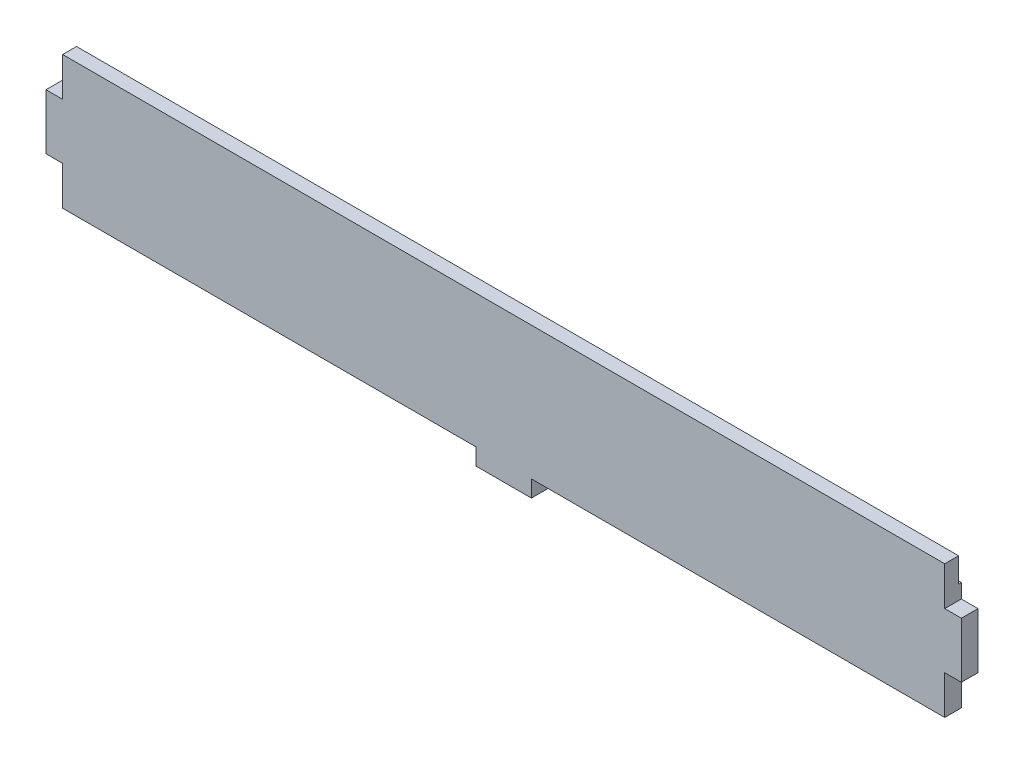
ISO-10303-21;
HEADER;
FILE_DESCRIPTION(('STEP AP214'),'2;1');
FILE_NAME('part.step','',(''),(''),'','','');
FILE_SCHEMA(('AUTOMOTIVE_DESIGN { 1 0 10303 214 1 1 1 1 }'));
ENDSEC;
DATA;
#1=APPLICATION_CONTEXT('core data for automotive mechanical design processes');
#2=APPLICATION_PROTOCOL_DEFINITION('international standard','automotive_design',2000,#1);
#3=PRODUCT_CONTEXT('',#1,'mechanical');
#4=PRODUCT('Part','Part','',(#3));
#5=PRODUCT_RELATED_PRODUCT_CATEGORY('part','',(#4));
#6=PRODUCT_DEFINITION_FORMATION('','',#4);
#7=PRODUCT_DEFINITION_CONTEXT('part definition',#1,'design');
#8=PRODUCT_DEFINITION('design','',#6,#7);
#9=PRODUCT_DEFINITION_SHAPE('','',#8);
#10=(LENGTH_UNIT() NAMED_UNIT(*) SI_UNIT(.MILLI.,.METRE.));
#11=(NAMED_UNIT(*) PLANE_ANGLE_UNIT() SI_UNIT($,.RADIAN.));
#12=(NAMED_UNIT(*) SI_UNIT($,.STERADIAN.) SOLID_ANGLE_UNIT());
#13=UNCERTAINTY_MEASURE_WITH_UNIT(LENGTH_MEASURE(1.E-05),#10,'distance_accuracy_value','');
#14=(GEOMETRIC_REPRESENTATION_CONTEXT(3) GLOBAL_UNCERTAINTY_ASSIGNED_CONTEXT((#13)) GLOBAL_UNIT_ASSIGNED_CONTEXT((#10,
#11,#12)) REPRESENTATION_CONTEXT('',''));
#15=CARTESIAN_POINT('',(0.,0.,0.));
#16=DIRECTION('',(0.,0.,1.));
#17=DIRECTION('',(1.,0.,0.));
#18=AXIS2_PLACEMENT_3D('',#15,#16,#17);
#19=CARTESIAN_POINT('',(0.,54.0000000000001,6.));
#20=DIRECTION('',(0.,-1.,0.));
#21=DIRECTION('',(1.,0.,0.));
#22=AXIS2_PLACEMENT_3D('',#19,#20,#21);
#23=PLANE('',#22);
#24=DIRECTION('',(1.,0.,0.));
#25=VECTOR('',#24,1.);
#26=CARTESIAN_POINT('',(-6.,54.0000000000001,1.));
#27=LINE('',#26,#25);
#28=CARTESIAN_POINT('',(-324.,54.0000000000001,1.));
#29=VERTEX_POINT('',#28);
#30=CARTESIAN_POINT('',(-6.,54.0000000000001,1.));
#31=VERTEX_POINT('',#30);
#32=EDGE_CURVE('E50',#29,#31,#27,.T.);
#33=ORIENTED_EDGE('',*,*,#32,.F.);
#34=DIRECTION('',(0.,0.,1.));
#35=VECTOR('',#34,1.);
#36=CARTESIAN_POINT('',(-324.,54.0000000000001,0.));
#37=LINE('',#36,#35);
#38=CARTESIAN_POINT('',(-324.,54.0000000000001,6.));
#39=VERTEX_POINT('',#38);
#40=EDGE_CURVE('E246',#29,#39,#37,.T.);
#41=ORIENTED_EDGE('',*,*,#40,.T.);
#42=DIRECTION('',(-1.,0.,0.));
#43=VECTOR('',#42,1.);
#44=CARTESIAN_POINT('',(0.,54.0000000000001,6.));
#45=LINE('',#44,#43);
#46=CARTESIAN_POINT('',(-6.,54.0000000000001,6.));
#47=VERTEX_POINT('',#46);
#48=EDGE_CURVE('E290',#47,#39,#45,.T.);
#49=ORIENTED_EDGE('',*,*,#48,.F.);
#50=DIRECTION('',(0.,0.,1.));
#51=VECTOR('',#50,1.);
#52=CARTESIAN_POINT('',(-6.,54.0000000000001,0.));
#53=LINE('',#52,#51);
#54=EDGE_CURVE('E189',#31,#47,#53,.T.);
#55=ORIENTED_EDGE('',*,*,#54,.F.);
#56=EDGE_LOOP('',(#33,#41,#49,#55));
#57=FACE_BOUND('',#56,.T.);
#58=ADVANCED_FACE('F33',(#57),#23,.F.);
#59=CARTESIAN_POINT('',(0.,0.,6.));
#60=DIRECTION('',(-1.,0.,0.));
#61=DIRECTION('',(0.,-1.,0.));
#62=AXIS2_PLACEMENT_3D('',#59,#60,#61);
#63=PLANE('',#62);
#64=DIRECTION('',(0.,1.,0.));
#65=VECTOR('',#64,1.);
#66=CARTESIAN_POINT('',(0.,0.,0.));
#67=LINE('',#66,#65);
#68=CARTESIAN_POINT('',(0.,20.,0.));
#69=VERTEX_POINT('',#68);
#70=CARTESIAN_POINT('',(0.,40.,0.));
#71=VERTEX_POINT('',#70);
#72=EDGE_CURVE('E279',#69,#71,#67,.T.);
#73=ORIENTED_EDGE('',*,*,#72,.T.);
#74=DIRECTION('',(0.,0.,1.));
#75=VECTOR('',#74,1.);
#76=CARTESIAN_POINT('',(0.,40.,0.));
#77=LINE('',#76,#75);
#78=CARTESIAN_POINT('',(0.,40.,6.));
#79=VERTEX_POINT('',#78);
#80=EDGE_CURVE('E193',#71,#79,#77,.T.);
#81=ORIENTED_EDGE('',*,*,#80,.T.);
#82=DIRECTION('',(0.,1.,0.));
#83=VECTOR('',#82,1.);
#84=CARTESIAN_POINT('',(0.,0.,6.));
#85=LINE('',#84,#83);
#86=CARTESIAN_POINT('',(0.,20.,6.));
#87=VERTEX_POINT('',#86);
#88=EDGE_CURVE('E287',#87,#79,#85,.T.);
#89=ORIENTED_EDGE('',*,*,#88,.F.);
#90=DIRECTION('',(0.,0.,1.));
#91=VECTOR('',#90,1.);
#92=CARTESIAN_POINT('',(0.,20.,0.));
#93=LINE('',#92,#91);
#94=EDGE_CURVE('E213',#69,#87,#93,.T.);
#95=ORIENTED_EDGE('',*,*,#94,.F.);
#96=EDGE_LOOP('',(#73,#81,#89,#95));
#97=FACE_BOUND('',#96,.T.);
#98=ADVANCED_FACE('F35',(#97),#63,.F.);
#99=CARTESIAN_POINT('',(-330.,0.,6.));
#100=DIRECTION('',(1.,0.,0.));
#101=DIRECTION('',(0.,0.,-1.));
#102=AXIS2_PLACEMENT_3D('',#99,#100,#101);
#103=PLANE('',#102);
#104=DIRECTION('',(0.,-1.,0.));
#105=VECTOR('',#104,1.);
#106=CARTESIAN_POINT('',(-330.,0.,6.));
#107=LINE('',#106,#105);
#108=CARTESIAN_POINT('',(-330.,40.,6.));
#109=VERTEX_POINT('',#108);
#110=CARTESIAN_POINT('',(-330.,20.,6.));
#111=VERTEX_POINT('',#110);
#112=EDGE_CURVE('E42',#109,#111,#107,.T.);
#113=ORIENTED_EDGE('',*,*,#112,.F.);
#114=DIRECTION('',(0.,0.,1.));
#115=VECTOR('',#114,1.);
#116=CARTESIAN_POINT('',(-330.,40.,0.));
#117=LINE('',#116,#115);
#118=CARTESIAN_POINT('',(-330.,40.,0.));
#119=VERTEX_POINT('',#118);
#120=EDGE_CURVE('E241',#119,#109,#117,.T.);
#121=ORIENTED_EDGE('',*,*,#120,.F.);
#122=DIRECTION('',(0.,-1.,0.));
#123=VECTOR('',#122,1.);
#124=CARTESIAN_POINT('',(-330.,0.,0.));
#125=LINE('',#124,#123);
#126=CARTESIAN_POINT('',(-330.,20.,0.));
#127=VERTEX_POINT('',#126);
#128=EDGE_CURVE('E295',#119,#127,#125,.T.);
#129=ORIENTED_EDGE('',*,*,#128,.T.);
#130=DIRECTION('',(0.,0.,1.));
#131=VECTOR('',#130,1.);
#132=CARTESIAN_POINT('',(-330.,20.,0.));
#133=LINE('',#132,#131);
#134=EDGE_CURVE('E276',#127,#111,#133,.T.);
#135=ORIENTED_EDGE('',*,*,#134,.T.);
#136=EDGE_LOOP('',(#113,#121,#129,#135));
#137=FACE_BOUND('',#136,.T.);
#138=ADVANCED_FACE('F333',(#137),#103,.F.);
#139=CARTESIAN_POINT('',(0.,0.,6.));
#140=DIRECTION('',(0.,1.,0.));
#141=DIRECTION('',(0.,0.,1.));
#142=AXIS2_PLACEMENT_3D('',#139,#140,#141);
#143=PLANE('',#142);
#144=DIRECTION('',(1.,0.,0.));
#145=VECTOR('',#144,1.);
#146=CARTESIAN_POINT('',(0.,0.,0.));
#147=LINE('',#146,#145);
#148=CARTESIAN_POINT('',(-175.,0.,0.));
#149=VERTEX_POINT('',#148);
#150=CARTESIAN_POINT('',(-155.,0.,0.));
#151=VERTEX_POINT('',#150);
#152=EDGE_CURVE('E37',#149,#151,#147,.T.);
#153=ORIENTED_EDGE('',*,*,#152,.T.);
#154=DIRECTION('',(0.,0.,1.));
#155=VECTOR('',#154,1.);
#156=CARTESIAN_POINT('',(-155.,0.,0.));
#157=LINE('',#156,#155);
#158=CARTESIAN_POINT('',(-155.,0.,6.));
#159=VERTEX_POINT('',#158);
#160=EDGE_CURVE('E223',#151,#159,#157,.T.);
#161=ORIENTED_EDGE('',*,*,#160,.T.);
#162=DIRECTION('',(1.,0.,0.));
#163=VECTOR('',#162,1.);
#164=CARTESIAN_POINT('',(0.,0.,6.));
#165=LINE('',#164,#163);
#166=CARTESIAN_POINT('',(-175.,0.,6.));
#167=VERTEX_POINT('',#166);
#168=EDGE_CURVE('E11',#167,#159,#165,.T.);
#169=ORIENTED_EDGE('',*,*,#168,.F.);
#170=DIRECTION('',(0.,0.,1.));
#171=VECTOR('',#170,1.);
#172=CARTESIAN_POINT('',(-175.,0.,0.));
#173=LINE('',#172,#171);
#174=EDGE_CURVE('E265',#149,#167,#173,.T.);
#175=ORIENTED_EDGE('',*,*,#174,.F.);
#176=EDGE_LOOP('',(#153,#161,#169,#175));
#177=FACE_BOUND('',#176,.T.);
#178=ADVANCED_FACE('F304',(#177),#143,.F.);
#179=CARTESIAN_POINT('',(0.,0.,6.));
#180=DIRECTION('',(0.,0.,1.));
#181=DIRECTION('',(1.,0.,0.));
#182=AXIS2_PLACEMENT_3D('',#179,#180,#181);
#183=PLANE('',#182);
#184=DIRECTION('',(1.,0.,0.));
#185=VECTOR('',#184,1.);
#186=CARTESIAN_POINT('',(0.,40.,6.));
#187=LINE('',#186,#185);
#188=CARTESIAN_POINT('',(-6.,40.,6.));
#189=VERTEX_POINT('',#188);
#190=EDGE_CURVE('E187',#189,#79,#187,.T.);
#191=ORIENTED_EDGE('',*,*,#190,.F.);
#192=DIRECTION('',(0.,-1.,0.));
#193=VECTOR('',#192,1.);
#194=CARTESIAN_POINT('',(-6.,40.,6.));
#195=LINE('',#194,#193);
#196=EDGE_CURVE('E180',#47,#189,#195,.T.);
#197=ORIENTED_EDGE('',*,*,#196,.F.);
#198=ORIENTED_EDGE('',*,*,#48,.T.);
#199=DIRECTION('',(0.,1.,0.));
#200=VECTOR('',#199,1.);
#201=CARTESIAN_POINT('',(-324.,40.,6.));
#202=LINE('',#201,#200);
#203=CARTESIAN_POINT('',(-324.,40.,6.));
#204=VERTEX_POINT('',#203);
#205=EDGE_CURVE('E238',#204,#39,#202,.T.);
#206=ORIENTED_EDGE('',*,*,#205,.F.);
#207=DIRECTION('',(1.,0.,0.));
#208=VECTOR('',#207,1.);
#209=CARTESIAN_POINT('',(-330.,40.,6.));
#210=LINE('',#209,#208);
#211=EDGE_CURVE('E226',#109,#204,#210,.T.);
#212=ORIENTED_EDGE('',*,*,#211,.F.);
#213=ORIENTED_EDGE('',*,*,#112,.T.);
#214=DIRECTION('',(-1.,0.,0.));
#215=VECTOR('',#214,1.);
#216=CARTESIAN_POINT('',(-330.,20.,6.));
#217=LINE('',#216,#215);
#218=CARTESIAN_POINT('',(-324.,20.,6.));
#219=VERTEX_POINT('',#218);
#220=EDGE_CURVE('E256',#219,#111,#217,.T.);
#221=ORIENTED_EDGE('',*,*,#220,.F.);
#222=DIRECTION('',(0.,1.,0.));
#223=VECTOR('',#222,1.);
#224=CARTESIAN_POINT('',(-324.,6.,6.));
#225=LINE('',#224,#223);
#226=CARTESIAN_POINT('',(-324.,6.,6.));
#227=VERTEX_POINT('',#226);
#228=EDGE_CURVE('E271',#227,#219,#225,.T.);
#229=ORIENTED_EDGE('',*,*,#228,.F.);
#230=DIRECTION('',(-1.,0.,0.));
#231=VECTOR('',#230,1.);
#232=CARTESIAN_POINT('',(-324.,6.,6.));
#233=LINE('',#232,#231);
#234=CARTESIAN_POINT('',(-175.,6.,6.));
#235=VERTEX_POINT('',#234);
#236=EDGE_CURVE('E268',#235,#227,#233,.T.);
#237=ORIENTED_EDGE('',*,*,#236,.F.);
#238=DIRECTION('',(0.,1.,0.));
#239=VECTOR('',#238,1.);
#240=CARTESIAN_POINT('',(-175.,0.,6.));
#241=LINE('',#240,#239);
#242=EDGE_CURVE('E248',#167,#235,#241,.T.);
#243=ORIENTED_EDGE('',*,*,#242,.F.);
#244=ORIENTED_EDGE('',*,*,#168,.T.);
#245=DIRECTION('',(0.,-1.,0.));
#246=VECTOR('',#245,1.);
#247=CARTESIAN_POINT('',(-155.,0.,6.));
#248=LINE('',#247,#246);
#249=CARTESIAN_POINT('',(-155.,6.,6.));
#250=VERTEX_POINT('',#249);
#251=EDGE_CURVE('E204',#250,#159,#248,.T.);
#252=ORIENTED_EDGE('',*,*,#251,.F.);
#253=DIRECTION('',(-1.,0.,0.));
#254=VECTOR('',#253,1.);
#255=CARTESIAN_POINT('',(-155.,6.,6.));
#256=LINE('',#255,#254);
#257=CARTESIAN_POINT('',(-6.00000000000001,6.,6.));
#258=VERTEX_POINT('',#257);
#259=EDGE_CURVE('E219',#258,#250,#256,.T.);
#260=ORIENTED_EDGE('',*,*,#259,.F.);
#261=DIRECTION('',(0.,-1.,0.));
#262=VECTOR('',#261,1.);
#263=CARTESIAN_POINT('',(-6.00000000000001,6.,6.));
#264=LINE('',#263,#262);
#265=CARTESIAN_POINT('',(-6.,20.,6.));
#266=VERTEX_POINT('',#265);
#267=EDGE_CURVE('E216',#266,#258,#264,.T.);
#268=ORIENTED_EDGE('',*,*,#267,.F.);
#269=DIRECTION('',(-1.,0.,0.));
#270=VECTOR('',#269,1.);
#271=CARTESIAN_POINT('',(0.,20.,6.));
#272=LINE('',#271,#270);
#273=EDGE_CURVE('E196',#87,#266,#272,.T.);
#274=ORIENTED_EDGE('',*,*,#273,.F.);
#275=ORIENTED_EDGE('',*,*,#88,.T.);
#276=EDGE_LOOP('',(#191,#197,#198,#206,#212,#213,#221,#229,#237,#243,#244,#252,#260,#268,#274,#275));
#277=FACE_BOUND('',#276,.T.);
#278=ADVANCED_FACE('F315',(#277),#183,.T.);
#279=CARTESIAN_POINT('',(0.,0.,0.));
#280=DIRECTION('',(0.,0.,1.));
#281=DIRECTION('',(1.,0.,0.));
#282=AXIS2_PLACEMENT_3D('',#279,#280,#281);
#283=PLANE('',#282);
#284=DIRECTION('',(0.,1.,0.));
#285=VECTOR('',#284,1.);
#286=CARTESIAN_POINT('',(-324.,40.,0.));
#287=LINE('',#286,#285);
#288=CARTESIAN_POINT('',(-324.,40.,0.));
#289=VERTEX_POINT('',#288);
#290=CARTESIAN_POINT('',(-324.,45.1296257369371,0.));
#291=VERTEX_POINT('',#290);
#292=EDGE_CURVE('E237',#289,#291,#287,.T.);
#293=ORIENTED_EDGE('',*,*,#292,.T.);
#294=DIRECTION('',(-1.,0.,0.));
#295=VECTOR('',#294,1.);
#296=CARTESIAN_POINT('',(-6.,45.1296257369371,0.));
#297=LINE('',#296,#295);
#298=CARTESIAN_POINT('',(-6.,45.1296257369371,0.));
#299=VERTEX_POINT('',#298);
#300=EDGE_CURVE('E175',#299,#291,#297,.T.);
#301=ORIENTED_EDGE('',*,*,#300,.F.);
#302=DIRECTION('',(0.,-1.,0.));
#303=VECTOR('',#302,1.);
#304=CARTESIAN_POINT('',(-6.,40.,0.));
#305=LINE('',#304,#303);
#306=CARTESIAN_POINT('',(-6.,40.,0.));
#307=VERTEX_POINT('',#306);
#308=EDGE_CURVE('E58',#299,#307,#305,.T.);
#309=ORIENTED_EDGE('',*,*,#308,.T.);
#310=DIRECTION('',(1.,0.,0.));
#311=VECTOR('',#310,1.);
#312=CARTESIAN_POINT('',(0.,40.,0.));
#313=LINE('',#312,#311);
#314=EDGE_CURVE('E186',#307,#71,#313,.T.);
#315=ORIENTED_EDGE('',*,*,#314,.T.);
#316=ORIENTED_EDGE('',*,*,#72,.F.);
#317=DIRECTION('',(-1.,0.,0.));
#318=VECTOR('',#317,1.);
#319=CARTESIAN_POINT('',(0.,20.,0.));
#320=LINE('',#319,#318);
#321=CARTESIAN_POINT('',(-6.,20.,0.));
#322=VERTEX_POINT('',#321);
#323=EDGE_CURVE('E200',#69,#322,#320,.T.);
#324=ORIENTED_EDGE('',*,*,#323,.T.);
#325=DIRECTION('',(0.,-1.,0.));
#326=VECTOR('',#325,1.);
#327=CARTESIAN_POINT('',(-6.00000000000001,6.,0.));
#328=LINE('',#327,#326);
#329=CARTESIAN_POINT('',(-6.00000000000001,6.,0.));
#330=VERTEX_POINT('',#329);
#331=EDGE_CURVE('E203',#322,#330,#328,.T.);
#332=ORIENTED_EDGE('',*,*,#331,.T.);
#333=DIRECTION('',(-1.,0.,0.));
#334=VECTOR('',#333,1.);
#335=CARTESIAN_POINT('',(-155.,6.,0.));
#336=LINE('',#335,#334);
#337=CARTESIAN_POINT('',(-155.,6.,0.));
#338=VERTEX_POINT('',#337);
#339=EDGE_CURVE('E207',#330,#338,#336,.T.);
#340=ORIENTED_EDGE('',*,*,#339,.T.);
#341=DIRECTION('',(0.,-1.,0.));
#342=VECTOR('',#341,1.);
#343=CARTESIAN_POINT('',(-155.,0.,0.));
#344=LINE('',#343,#342);
#345=EDGE_CURVE('E210',#338,#151,#344,.T.);
#346=ORIENTED_EDGE('',*,*,#345,.T.);
#347=ORIENTED_EDGE('',*,*,#152,.F.);
#348=DIRECTION('',(0.,1.,0.));
#349=VECTOR('',#348,1.);
#350=CARTESIAN_POINT('',(-175.,0.,0.));
#351=LINE('',#350,#349);
#352=CARTESIAN_POINT('',(-175.,6.,0.));
#353=VERTEX_POINT('',#352);
#354=EDGE_CURVE('E252',#149,#353,#351,.T.);
#355=ORIENTED_EDGE('',*,*,#354,.T.);
#356=DIRECTION('',(-1.,0.,0.));
#357=VECTOR('',#356,1.);
#358=CARTESIAN_POINT('',(-324.,6.,0.));
#359=LINE('',#358,#357);
#360=CARTESIAN_POINT('',(-324.,6.,0.));
#361=VERTEX_POINT('',#360);
#362=EDGE_CURVE('E255',#353,#361,#359,.T.);
#363=ORIENTED_EDGE('',*,*,#362,.T.);
#364=DIRECTION('',(0.,1.,0.));
#365=VECTOR('',#364,1.);
#366=CARTESIAN_POINT('',(-324.,6.,0.));
#367=LINE('',#366,#365);
#368=CARTESIAN_POINT('',(-324.,20.,0.));
#369=VERTEX_POINT('',#368);
#370=EDGE_CURVE('E259',#361,#369,#367,.T.);
#371=ORIENTED_EDGE('',*,*,#370,.T.);
#372=DIRECTION('',(-1.,0.,0.));
#373=VECTOR('',#372,1.);
#374=CARTESIAN_POINT('',(-330.,20.,0.));
#375=LINE('',#374,#373);
#376=EDGE_CURVE('E262',#369,#127,#375,.T.);
#377=ORIENTED_EDGE('',*,*,#376,.T.);
#378=ORIENTED_EDGE('',*,*,#128,.F.);
#379=DIRECTION('',(1.,0.,0.));
#380=VECTOR('',#379,1.);
#381=CARTESIAN_POINT('',(-330.,40.,0.));
#382=LINE('',#381,#380);
#383=EDGE_CURVE('E234',#119,#289,#382,.T.);
#384=ORIENTED_EDGE('',*,*,#383,.T.);
#385=EDGE_LOOP('',(#293,#301,#309,#315,#316,#324,#332,#340,#346,#347,#355,#363,#371,#377,#378,#384));
#386=FACE_BOUND('',#385,.T.);
#387=ADVANCED_FACE('F306',(#386),#283,.F.);
#388=CARTESIAN_POINT('',(-330.,20.,0.));
#389=DIRECTION('',(0.,1.,0.));
#390=DIRECTION('',(0.,0.,1.));
#391=AXIS2_PLACEMENT_3D('',#388,#389,#390);
#392=PLANE('',#391);
#393=ORIENTED_EDGE('',*,*,#220,.T.);
#394=ORIENTED_EDGE('',*,*,#134,.F.);
#395=ORIENTED_EDGE('',*,*,#376,.F.);
#396=DIRECTION('',(0.,0.,1.));
#397=VECTOR('',#396,1.);
#398=CARTESIAN_POINT('',(-324.,20.,0.));
#399=LINE('',#398,#397);
#400=EDGE_CURVE('E280',#369,#219,#399,.T.);
#401=ORIENTED_EDGE('',*,*,#400,.T.);
#402=EDGE_LOOP('',(#393,#394,#395,#401));
#403=FACE_BOUND('',#402,.T.);
#404=ADVANCED_FACE('F331',(#403),#392,.F.);
#405=CARTESIAN_POINT('',(-324.,6.,0.));
#406=DIRECTION('',(1.,0.,0.));
#407=DIRECTION('',(0.,0.,-1.));
#408=AXIS2_PLACEMENT_3D('',#405,#406,#407);
#409=PLANE('',#408);
#410=ORIENTED_EDGE('',*,*,#228,.T.);
#411=ORIENTED_EDGE('',*,*,#400,.F.);
#412=ORIENTED_EDGE('',*,*,#370,.F.);
#413=DIRECTION('',(0.,0.,1.));
#414=VECTOR('',#413,1.);
#415=CARTESIAN_POINT('',(-324.,6.,0.));
#416=LINE('',#415,#414);
#417=EDGE_CURVE('E282',#361,#227,#416,.T.);
#418=ORIENTED_EDGE('',*,*,#417,.T.);
#419=EDGE_LOOP('',(#410,#411,#412,#418));
#420=FACE_BOUND('',#419,.T.);
#421=ADVANCED_FACE('F328',(#420),#409,.F.);
#422=CARTESIAN_POINT('',(-324.,6.,0.));
#423=DIRECTION('',(0.,1.,0.));
#424=DIRECTION('',(0.,0.,1.));
#425=AXIS2_PLACEMENT_3D('',#422,#423,#424);
#426=PLANE('',#425);
#427=ORIENTED_EDGE('',*,*,#236,.T.);
#428=ORIENTED_EDGE('',*,*,#417,.F.);
#429=ORIENTED_EDGE('',*,*,#362,.F.);
#430=DIRECTION('',(0.,0.,1.));
#431=VECTOR('',#430,1.);
#432=CARTESIAN_POINT('',(-175.,6.,0.));
#433=LINE('',#432,#431);
#434=EDGE_CURVE('E284',#353,#235,#433,.T.);
#435=ORIENTED_EDGE('',*,*,#434,.T.);
#436=EDGE_LOOP('',(#427,#428,#429,#435));
#437=FACE_BOUND('',#436,.T.);
#438=ADVANCED_FACE('F324',(#437),#426,.F.);
#439=CARTESIAN_POINT('',(-175.,0.,0.));
#440=DIRECTION('',(1.,0.,0.));
#441=DIRECTION('',(0.,0.,-1.));
#442=AXIS2_PLACEMENT_3D('',#439,#440,#441);
#443=PLANE('',#442);
#444=ORIENTED_EDGE('',*,*,#242,.T.);
#445=ORIENTED_EDGE('',*,*,#434,.F.);
#446=ORIENTED_EDGE('',*,*,#354,.F.);
#447=ORIENTED_EDGE('',*,*,#174,.T.);
#448=EDGE_LOOP('',(#444,#445,#446,#447));
#449=FACE_BOUND('',#448,.T.);
#450=ADVANCED_FACE('F322',(#449),#443,.F.);
#451=CARTESIAN_POINT('',(-324.,40.,0.));
#452=DIRECTION('',(1.,0.,0.));
#453=DIRECTION('',(0.,0.,-1.));
#454=AXIS2_PLACEMENT_3D('',#451,#452,#453);
#455=PLANE('',#454);
#456=DIRECTION('',(0.,1.,0.));
#457=VECTOR('',#456,1.);
#458=CARTESIAN_POINT('',(-324.,54.0000000000001,1.));
#459=LINE('',#458,#457);
#460=CARTESIAN_POINT('',(-324.,45.1296257369371,1.));
#461=VERTEX_POINT('',#460);
#462=EDGE_CURVE('E169',#461,#29,#459,.T.);
#463=ORIENTED_EDGE('',*,*,#462,.F.);
#464=DIRECTION('',(0.,0.,-1.));
#465=VECTOR('',#464,1.);
#466=CARTESIAN_POINT('',(-324.,45.1296257369371,1.));
#467=LINE('',#466,#465);
#468=EDGE_CURVE('E167',#461,#291,#467,.T.);
#469=ORIENTED_EDGE('',*,*,#468,.T.);
#470=ORIENTED_EDGE('',*,*,#292,.F.);
#471=DIRECTION('',(0.,0.,1.));
#472=VECTOR('',#471,1.);
#473=CARTESIAN_POINT('',(-324.,40.,0.));
#474=LINE('',#473,#472);
#475=EDGE_CURVE('E249',#289,#204,#474,.T.);
#476=ORIENTED_EDGE('',*,*,#475,.T.);
#477=ORIENTED_EDGE('',*,*,#205,.T.);
#478=ORIENTED_EDGE('',*,*,#40,.F.);
#479=EDGE_LOOP('',(#463,#469,#470,#476,#477,#478));
#480=FACE_BOUND('',#479,.T.);
#481=ADVANCED_FACE('F340',(#480),#455,.F.);
#482=CARTESIAN_POINT('',(-330.,40.,0.));
#483=DIRECTION('',(0.,-1.,0.));
#484=DIRECTION('',(0.,0.,-1.));
#485=AXIS2_PLACEMENT_3D('',#482,#483,#484);
#486=PLANE('',#485);
#487=ORIENTED_EDGE('',*,*,#211,.T.);
#488=ORIENTED_EDGE('',*,*,#475,.F.);
#489=ORIENTED_EDGE('',*,*,#383,.F.);
#490=ORIENTED_EDGE('',*,*,#120,.T.);
#491=EDGE_LOOP('',(#487,#488,#489,#490));
#492=FACE_BOUND('',#491,.T.);
#493=ADVANCED_FACE('F338',(#492),#486,.F.);
#494=CARTESIAN_POINT('',(-155.,0.,0.));
#495=DIRECTION('',(-1.,0.,0.));
#496=DIRECTION('',(0.,0.,1.));
#497=AXIS2_PLACEMENT_3D('',#494,#495,#496);
#498=PLANE('',#497);
#499=ORIENTED_EDGE('',*,*,#251,.T.);
#500=ORIENTED_EDGE('',*,*,#160,.F.);
#501=ORIENTED_EDGE('',*,*,#345,.F.);
#502=DIRECTION('',(0.,0.,1.));
#503=VECTOR('',#502,1.);
#504=CARTESIAN_POINT('',(-155.,6.,0.));
#505=LINE('',#504,#503);
#506=EDGE_CURVE('E227',#338,#250,#505,.T.);
#507=ORIENTED_EDGE('',*,*,#506,.T.);
#508=EDGE_LOOP('',(#499,#500,#501,#507));
#509=FACE_BOUND('',#508,.T.);
#510=ADVANCED_FACE('F310',(#509),#498,.F.);
#511=CARTESIAN_POINT('',(-155.,6.,0.));
#512=DIRECTION('',(0.,1.,0.));
#513=DIRECTION('',(0.,0.,1.));
#514=AXIS2_PLACEMENT_3D('',#511,#512,#513);
#515=PLANE('',#514);
#516=ORIENTED_EDGE('',*,*,#259,.T.);
#517=ORIENTED_EDGE('',*,*,#506,.F.);
#518=ORIENTED_EDGE('',*,*,#339,.F.);
#519=DIRECTION('',(0.,0.,1.));
#520=VECTOR('',#519,1.);
#521=CARTESIAN_POINT('',(-6.00000000000001,6.,0.));
#522=LINE('',#521,#520);
#523=EDGE_CURVE('E229',#330,#258,#522,.T.);
#524=ORIENTED_EDGE('',*,*,#523,.T.);
#525=EDGE_LOOP('',(#516,#517,#518,#524));
#526=FACE_BOUND('',#525,.T.);
#527=ADVANCED_FACE('F359',(#526),#515,.F.);
#528=CARTESIAN_POINT('',(-6.00000000000001,6.,0.));
#529=DIRECTION('',(-1.,0.,0.));
#530=DIRECTION('',(0.,-1.,0.));
#531=AXIS2_PLACEMENT_3D('',#528,#529,#530);
#532=PLANE('',#531);
#533=ORIENTED_EDGE('',*,*,#267,.T.);
#534=ORIENTED_EDGE('',*,*,#523,.F.);
#535=ORIENTED_EDGE('',*,*,#331,.F.);
#536=DIRECTION('',(0.,0.,1.));
#537=VECTOR('',#536,1.);
#538=CARTESIAN_POINT('',(-6.,20.,0.));
#539=LINE('',#538,#537);
#540=EDGE_CURVE('E231',#322,#266,#539,.T.);
#541=ORIENTED_EDGE('',*,*,#540,.T.);
#542=EDGE_LOOP('',(#533,#534,#535,#541));
#543=FACE_BOUND('',#542,.T.);
#544=ADVANCED_FACE('F357',(#543),#532,.F.);
#545=CARTESIAN_POINT('',(0.,20.,0.));
#546=DIRECTION('',(0.,1.,0.));
#547=DIRECTION('',(0.,0.,1.));
#548=AXIS2_PLACEMENT_3D('',#545,#546,#547);
#549=PLANE('',#548);
#550=ORIENTED_EDGE('',*,*,#273,.T.);
#551=ORIENTED_EDGE('',*,*,#540,.F.);
#552=ORIENTED_EDGE('',*,*,#323,.F.);
#553=ORIENTED_EDGE('',*,*,#94,.T.);
#554=EDGE_LOOP('',(#550,#551,#552,#553));
#555=FACE_BOUND('',#554,.T.);
#556=ADVANCED_FACE('F355',(#555),#549,.F.);
#557=CARTESIAN_POINT('',(0.,40.,0.));
#558=DIRECTION('',(0.,-1.,0.));
#559=DIRECTION('',(0.,0.,-1.));
#560=AXIS2_PLACEMENT_3D('',#557,#558,#559);
#561=PLANE('',#560);
#562=ORIENTED_EDGE('',*,*,#190,.T.);
#563=ORIENTED_EDGE('',*,*,#80,.F.);
#564=ORIENTED_EDGE('',*,*,#314,.F.);
#565=DIRECTION('',(0.,0.,1.));
#566=VECTOR('',#565,1.);
#567=CARTESIAN_POINT('',(-6.,40.,0.));
#568=LINE('',#567,#566);
#569=EDGE_CURVE('E197',#307,#189,#568,.T.);
#570=ORIENTED_EDGE('',*,*,#569,.T.);
#571=EDGE_LOOP('',(#562,#563,#564,#570));
#572=FACE_BOUND('',#571,.T.);
#573=ADVANCED_FACE('F349',(#572),#561,.F.);
#574=CARTESIAN_POINT('',(-6.,40.,0.));
#575=DIRECTION('',(-1.,0.,0.));
#576=DIRECTION('',(0.,-1.,0.));
#577=AXIS2_PLACEMENT_3D('',#574,#575,#576);
#578=PLANE('',#577);
#579=ORIENTED_EDGE('',*,*,#308,.F.);
#580=DIRECTION('',(0.,0.,-1.));
#581=VECTOR('',#580,1.);
#582=CARTESIAN_POINT('',(-6.,45.1296257369371,1.));
#583=LINE('',#582,#581);
#584=CARTESIAN_POINT('',(-6.,45.1296257369371,1.));
#585=VERTEX_POINT('',#584);
#586=EDGE_CURVE('E165',#585,#299,#583,.T.);
#587=ORIENTED_EDGE('',*,*,#586,.F.);
#588=DIRECTION('',(0.,-1.,0.));
#589=VECTOR('',#588,1.);
#590=CARTESIAN_POINT('',(-6.,54.0000000000001,1.));
#591=LINE('',#590,#589);
#592=EDGE_CURVE('E170',#31,#585,#591,.T.);
#593=ORIENTED_EDGE('',*,*,#592,.F.);
#594=ORIENTED_EDGE('',*,*,#54,.T.);
#595=ORIENTED_EDGE('',*,*,#196,.T.);
#596=ORIENTED_EDGE('',*,*,#569,.F.);
#597=EDGE_LOOP('',(#579,#587,#593,#594,#595,#596));
#598=FACE_BOUND('',#597,.T.);
#599=ADVANCED_FACE('F177',(#598),#578,.F.);
#600=CARTESIAN_POINT('',(-6.,45.1296257369371,1.));
#601=DIRECTION('',(0.,-1.,0.));
#602=DIRECTION('',(0.,0.,-1.));
#603=AXIS2_PLACEMENT_3D('',#600,#601,#602);
#604=PLANE('',#603);
#605=ORIENTED_EDGE('',*,*,#300,.T.);
#606=ORIENTED_EDGE('',*,*,#468,.F.);
#607=DIRECTION('',(-1.,0.,0.));
#608=VECTOR('',#607,1.);
#609=CARTESIAN_POINT('',(-6.,45.1296257369371,1.));
#610=LINE('',#609,#608);
#611=EDGE_CURVE('E162',#585,#461,#610,.T.);
#612=ORIENTED_EDGE('',*,*,#611,.F.);
#613=ORIENTED_EDGE('',*,*,#586,.T.);
#614=EDGE_LOOP('',(#605,#606,#612,#613));
#615=FACE_BOUND('',#614,.T.);
#616=ADVANCED_FACE('F163',(#615),#604,.F.);
#617=CARTESIAN_POINT('',(0.,0.,1.));
#618=DIRECTION('',(0.,0.,-1.));
#619=DIRECTION('',(-1.,0.,0.));
#620=AXIS2_PLACEMENT_3D('',#617,#618,#619);
#621=PLANE('',#620);
#622=ORIENTED_EDGE('',*,*,#592,.T.);
#623=ORIENTED_EDGE('',*,*,#611,.T.);
#624=ORIENTED_EDGE('',*,*,#462,.T.);
#625=ORIENTED_EDGE('',*,*,#32,.T.);
#626=EDGE_LOOP('',(#622,#623,#624,#625));
#627=FACE_BOUND('',#626,.T.);
#628=ADVANCED_FACE('F172',(#627),#621,.T.);
#629=CLOSED_SHELL('',(#58,#98,#138,#178,#278,#387,#404,#421,#438,#450,#481,#493,#510,#527,#544,
#556,#573,#599,#616,#628));
#630=MANIFOLD_SOLID_BREP('B2',#629);
#631=ADVANCED_BREP_SHAPE_REPRESENTATION('',(#18,#630),#14);
#632=SHAPE_DEFINITION_REPRESENTATION(#9,#631);
ENDSEC;
END-ISO-10303-21;
